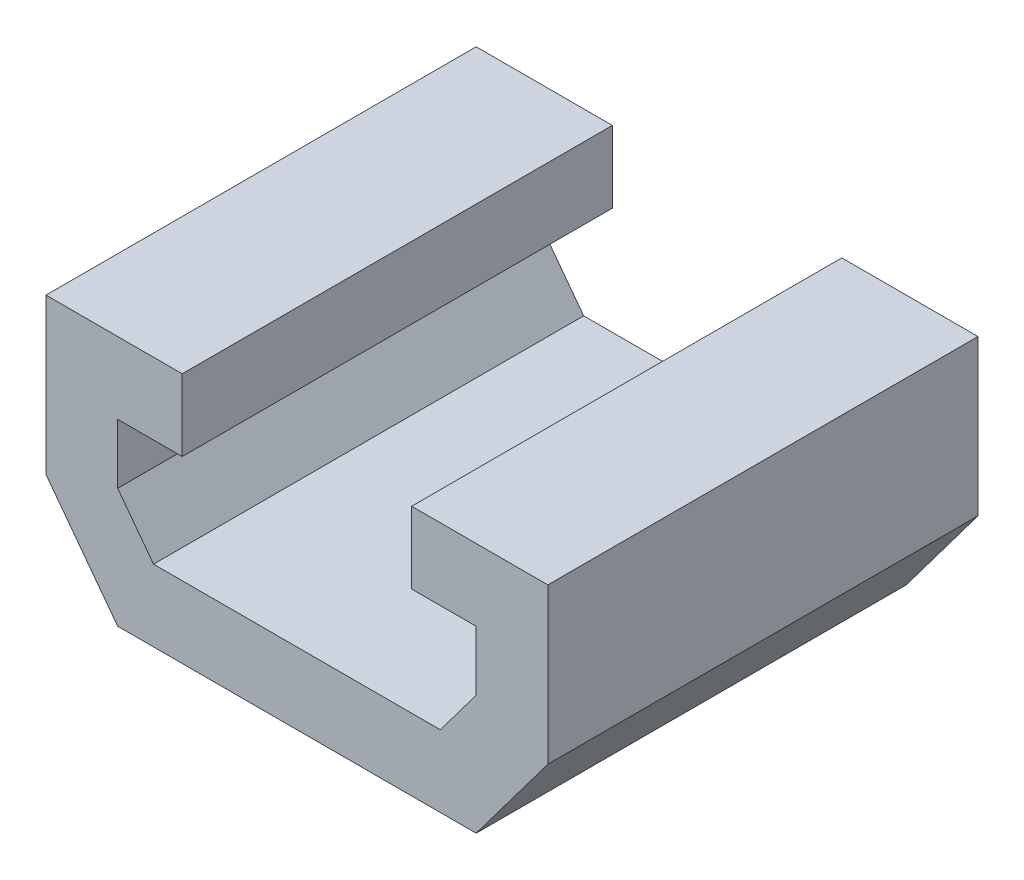
ISO-10303-21;
HEADER;
FILE_DESCRIPTION(('STEP AP214'),'2;1');
FILE_NAME('part.step','',(''),(''),'','','');
FILE_SCHEMA(('AUTOMOTIVE_DESIGN { 1 0 10303 214 1 1 1 1 }'));
ENDSEC;
DATA;
#1=APPLICATION_CONTEXT('core data for automotive mechanical design processes');
#2=APPLICATION_PROTOCOL_DEFINITION('international standard','automotive_design',2000,#1);
#3=PRODUCT_CONTEXT('',#1,'mechanical');
#4=PRODUCT('Part','Part','',(#3));
#5=PRODUCT_RELATED_PRODUCT_CATEGORY('part','',(#4));
#6=PRODUCT_DEFINITION_FORMATION('','',#4);
#7=PRODUCT_DEFINITION_CONTEXT('part definition',#1,'design');
#8=PRODUCT_DEFINITION('design','',#6,#7);
#9=PRODUCT_DEFINITION_SHAPE('','',#8);
#10=(LENGTH_UNIT() NAMED_UNIT(*) SI_UNIT(.MILLI.,.METRE.));
#11=(NAMED_UNIT(*) PLANE_ANGLE_UNIT() SI_UNIT($,.RADIAN.));
#12=(NAMED_UNIT(*) SI_UNIT($,.STERADIAN.) SOLID_ANGLE_UNIT());
#13=UNCERTAINTY_MEASURE_WITH_UNIT(LENGTH_MEASURE(1.E-05),#10,'distance_accuracy_value','');
#14=(GEOMETRIC_REPRESENTATION_CONTEXT(3) GLOBAL_UNCERTAINTY_ASSIGNED_CONTEXT((#13)) GLOBAL_UNIT_ASSIGNED_CONTEXT((#10,
#11,#12)) REPRESENTATION_CONTEXT('',''));
#15=CARTESIAN_POINT('',(0.,0.,0.));
#16=DIRECTION('',(0.,0.,1.));
#17=DIRECTION('',(1.,0.,0.));
#18=AXIS2_PLACEMENT_3D('',#15,#16,#17);
#19=CARTESIAN_POINT('',(-3.175,1.905,7.62));
#20=DIRECTION('',(0.,1.,0.));
#21=DIRECTION('',(-1.,0.,0.));
#22=AXIS2_PLACEMENT_3D('',#19,#20,#21);
#23=PLANE('',#22);
#24=DIRECTION('',(1.,0.,0.));
#25=VECTOR('',#24,1.);
#26=CARTESIAN_POINT('',(-3.175,1.905,0.));
#27=LINE('',#26,#25);
#28=CARTESIAN_POINT('',(-3.175,1.905,0.));
#29=VERTEX_POINT('',#28);
#30=CARTESIAN_POINT('',(-2.032,1.905,0.));
#31=VERTEX_POINT('',#30);
#32=EDGE_CURVE('E147',#29,#31,#27,.T.);
#33=ORIENTED_EDGE('',*,*,#32,.T.);
#34=DIRECTION('',(0.,0.,-1.));
#35=VECTOR('',#34,1.);
#36=CARTESIAN_POINT('',(-2.032,1.905,7.62));
#37=LINE('',#36,#35);
#38=CARTESIAN_POINT('',(-2.032,1.905,7.62));
#39=VERTEX_POINT('',#38);
#40=EDGE_CURVE('E11',#39,#31,#37,.T.);
#41=ORIENTED_EDGE('',*,*,#40,.F.);
#42=DIRECTION('',(1.,0.,0.));
#43=VECTOR('',#42,1.);
#44=CARTESIAN_POINT('',(-3.175,1.905,7.62));
#45=LINE('',#44,#43);
#46=CARTESIAN_POINT('',(-3.175,1.905,7.62));
#47=VERTEX_POINT('',#46);
#48=EDGE_CURVE('E97',#47,#39,#45,.T.);
#49=ORIENTED_EDGE('',*,*,#48,.F.);
#50=DIRECTION('',(0.,0.,-1.));
#51=VECTOR('',#50,1.);
#52=CARTESIAN_POINT('',(-3.175,1.905,7.62));
#53=LINE('',#52,#51);
#54=EDGE_CURVE('E143',#47,#29,#53,.T.);
#55=ORIENTED_EDGE('',*,*,#54,.T.);
#56=EDGE_LOOP('',(#33,#41,#49,#55));
#57=FACE_BOUND('',#56,.T.);
#58=ADVANCED_FACE('F39',(#57),#23,.F.);
#59=CARTESIAN_POINT('',(-2.032,3.175,7.62));
#60=DIRECTION('',(1.,0.,0.));
#61=DIRECTION('',(0.,1.,0.));
#62=AXIS2_PLACEMENT_3D('',#59,#60,#61);
#63=PLANE('',#62);
#64=DIRECTION('',(0.,-1.,0.));
#65=VECTOR('',#64,1.);
#66=CARTESIAN_POINT('',(-2.032,3.175,0.));
#67=LINE('',#66,#65);
#68=CARTESIAN_POINT('',(-2.032,3.175,0.));
#69=VERTEX_POINT('',#68);
#70=EDGE_CURVE('E151',#69,#31,#67,.T.);
#71=ORIENTED_EDGE('',*,*,#70,.F.);
#72=DIRECTION('',(0.,0.,-1.));
#73=VECTOR('',#72,1.);
#74=CARTESIAN_POINT('',(-2.032,3.175,7.62));
#75=LINE('',#74,#73);
#76=CARTESIAN_POINT('',(-2.032,3.175,7.62));
#77=VERTEX_POINT('',#76);
#78=EDGE_CURVE('E48',#77,#69,#75,.T.);
#79=ORIENTED_EDGE('',*,*,#78,.F.);
#80=DIRECTION('',(0.,-1.,0.));
#81=VECTOR('',#80,1.);
#82=CARTESIAN_POINT('',(-2.032,3.175,7.62));
#83=LINE('',#82,#81);
#84=EDGE_CURVE('E212',#77,#39,#83,.T.);
#85=ORIENTED_EDGE('',*,*,#84,.T.);
#86=ORIENTED_EDGE('',*,*,#40,.T.);
#87=EDGE_LOOP('',(#71,#79,#85,#86));
#88=FACE_BOUND('',#87,.T.);
#89=ADVANCED_FACE('F199',(#88),#63,.T.);
#90=CARTESIAN_POINT('',(-3.175,3.175,7.62));
#91=DIRECTION('',(0.,1.,0.));
#92=DIRECTION('',(-1.,0.,0.));
#93=AXIS2_PLACEMENT_3D('',#90,#91,#92);
#94=PLANE('',#93);
#95=DIRECTION('',(1.,0.,0.));
#96=VECTOR('',#95,1.);
#97=CARTESIAN_POINT('',(-3.175,3.175,0.));
#98=LINE('',#97,#96);
#99=CARTESIAN_POINT('',(-4.445,3.175,0.));
#100=VERTEX_POINT('',#99);
#101=EDGE_CURVE('E156',#100,#69,#98,.T.);
#102=ORIENTED_EDGE('',*,*,#101,.F.);
#103=DIRECTION('',(0.,0.,-1.));
#104=VECTOR('',#103,1.);
#105=CARTESIAN_POINT('',(-4.445,3.175,7.62));
#106=LINE('',#105,#104);
#107=CARTESIAN_POINT('',(-4.445,3.175,7.62));
#108=VERTEX_POINT('',#107);
#109=EDGE_CURVE('E187',#108,#100,#106,.T.);
#110=ORIENTED_EDGE('',*,*,#109,.F.);
#111=DIRECTION('',(1.,0.,0.));
#112=VECTOR('',#111,1.);
#113=CARTESIAN_POINT('',(-3.175,3.175,7.62));
#114=LINE('',#113,#112);
#115=EDGE_CURVE('E196',#108,#77,#114,.T.);
#116=ORIENTED_EDGE('',*,*,#115,.T.);
#117=ORIENTED_EDGE('',*,*,#78,.T.);
#118=EDGE_LOOP('',(#102,#110,#116,#117));
#119=FACE_BOUND('',#118,.T.);
#120=ADVANCED_FACE('F194',(#119),#94,.T.);
#121=CARTESIAN_POINT('',(-4.445,0.846666666666666,7.62));
#122=DIRECTION('',(-1.,0.,0.));
#123=DIRECTION('',(0.,0.,1.));
#124=AXIS2_PLACEMENT_3D('',#121,#122,#123);
#125=PLANE('',#124);
#126=DIRECTION('',(0.,1.,0.));
#127=VECTOR('',#126,1.);
#128=CARTESIAN_POINT('',(-4.445,0.846666666666666,0.));
#129=LINE('',#128,#127);
#130=CARTESIAN_POINT('',(-4.445,0.423333333333334,0.));
#131=VERTEX_POINT('',#130);
#132=EDGE_CURVE('E160',#131,#100,#129,.T.);
#133=ORIENTED_EDGE('',*,*,#132,.F.);
#134=DIRECTION('',(0.,0.,-1.));
#135=VECTOR('',#134,1.);
#136=CARTESIAN_POINT('',(-4.445,0.423333333333334,7.62));
#137=LINE('',#136,#135);
#138=CARTESIAN_POINT('',(-4.445,0.423333333333334,7.62));
#139=VERTEX_POINT('',#138);
#140=EDGE_CURVE('E184',#139,#131,#137,.T.);
#141=ORIENTED_EDGE('',*,*,#140,.F.);
#142=DIRECTION('',(0.,1.,0.));
#143=VECTOR('',#142,1.);
#144=CARTESIAN_POINT('',(-4.445,0.846666666666666,7.62));
#145=LINE('',#144,#143);
#146=EDGE_CURVE('E209',#139,#108,#145,.T.);
#147=ORIENTED_EDGE('',*,*,#146,.T.);
#148=ORIENTED_EDGE('',*,*,#109,.T.);
#149=EDGE_LOOP('',(#133,#141,#147,#148));
#150=FACE_BOUND('',#149,.T.);
#151=ADVANCED_FACE('F206',(#150),#125,.T.);
#152=CARTESIAN_POINT('',(-3.556,-0.762,7.62));
#153=DIRECTION('',(-0.8,-0.6,0.));
#154=DIRECTION('',(0.6,-0.8,0.));
#155=AXIS2_PLACEMENT_3D('',#152,#153,#154);
#156=PLANE('',#155);
#157=DIRECTION('',(-0.6,0.8,0.));
#158=VECTOR('',#157,1.);
#159=CARTESIAN_POINT('',(-3.556,-0.762,0.));
#160=LINE('',#159,#158);
#161=CARTESIAN_POINT('',(-3.175,-1.27,0.));
#162=VERTEX_POINT('',#161);
#163=EDGE_CURVE('E164',#162,#131,#160,.T.);
#164=ORIENTED_EDGE('',*,*,#163,.F.);
#165=DIRECTION('',(0.,0.,-1.));
#166=VECTOR('',#165,1.);
#167=CARTESIAN_POINT('',(-3.175,-1.27,7.62));
#168=LINE('',#167,#166);
#169=CARTESIAN_POINT('',(-3.175,-1.27,7.62));
#170=VERTEX_POINT('',#169);
#171=EDGE_CURVE('E136',#170,#162,#168,.T.);
#172=ORIENTED_EDGE('',*,*,#171,.F.);
#173=DIRECTION('',(-0.6,0.8,0.));
#174=VECTOR('',#173,1.);
#175=CARTESIAN_POINT('',(-3.556,-0.762,7.62));
#176=LINE('',#175,#174);
#177=EDGE_CURVE('E217',#170,#139,#176,.T.);
#178=ORIENTED_EDGE('',*,*,#177,.T.);
#179=ORIENTED_EDGE('',*,*,#140,.T.);
#180=EDGE_LOOP('',(#164,#172,#178,#179));
#181=FACE_BOUND('',#180,.T.);
#182=ADVANCED_FACE('F472',(#181),#156,.T.);
#183=CARTESIAN_POINT('',(0.,-1.27,7.62));
#184=DIRECTION('',(0.,-1.,0.));
#185=DIRECTION('',(1.,0.,0.));
#186=AXIS2_PLACEMENT_3D('',#183,#184,#185);
#187=PLANE('',#186);
#188=DIRECTION('',(-1.,0.,0.));
#189=VECTOR('',#188,1.);
#190=CARTESIAN_POINT('',(0.,-1.27,0.));
#191=LINE('',#190,#189);
#192=CARTESIAN_POINT('',(3.175,-1.27,0.));
#193=VERTEX_POINT('',#192);
#194=EDGE_CURVE('E168',#193,#162,#191,.T.);
#195=ORIENTED_EDGE('',*,*,#194,.F.);
#196=DIRECTION('',(0.,0.,-1.));
#197=VECTOR('',#196,1.);
#198=CARTESIAN_POINT('',(3.175,-1.27,7.62));
#199=LINE('',#198,#197);
#200=CARTESIAN_POINT('',(3.175,-1.27,7.62));
#201=VERTEX_POINT('',#200);
#202=EDGE_CURVE('E232',#201,#193,#199,.T.);
#203=ORIENTED_EDGE('',*,*,#202,.F.);
#204=DIRECTION('',(-1.,0.,0.));
#205=VECTOR('',#204,1.);
#206=CARTESIAN_POINT('',(0.,-1.27,7.62));
#207=LINE('',#206,#205);
#208=EDGE_CURVE('E129',#201,#170,#207,.T.);
#209=ORIENTED_EDGE('',*,*,#208,.T.);
#210=ORIENTED_EDGE('',*,*,#171,.T.);
#211=EDGE_LOOP('',(#195,#203,#209,#210));
#212=FACE_BOUND('',#211,.T.);
#213=ADVANCED_FACE('F229',(#212),#187,.T.);
#214=CARTESIAN_POINT('',(0.,0.,7.62));
#215=DIRECTION('',(0.,-1.,0.));
#216=DIRECTION('',(1.,0.,0.));
#217=AXIS2_PLACEMENT_3D('',#214,#215,#216);
#218=PLANE('',#217);
#219=DIRECTION('',(-1.,0.,0.));
#220=VECTOR('',#219,1.);
#221=CARTESIAN_POINT('',(0.,0.,0.));
#222=LINE('',#221,#220);
#223=CARTESIAN_POINT('',(2.54,0.,0.));
#224=VERTEX_POINT('',#223);
#225=CARTESIAN_POINT('',(-2.54,0.,0.));
#226=VERTEX_POINT('',#225);
#227=EDGE_CURVE('E134',#224,#226,#222,.T.);
#228=ORIENTED_EDGE('',*,*,#227,.T.);
#229=DIRECTION('',(0.,0.,-1.));
#230=VECTOR('',#229,1.);
#231=CARTESIAN_POINT('',(-2.54,0.,7.62));
#232=LINE('',#231,#230);
#233=CARTESIAN_POINT('',(-2.54,0.,7.62));
#234=VERTEX_POINT('',#233);
#235=EDGE_CURVE('E131',#234,#226,#232,.T.);
#236=ORIENTED_EDGE('',*,*,#235,.F.);
#237=DIRECTION('',(-1.,0.,0.));
#238=VECTOR('',#237,1.);
#239=CARTESIAN_POINT('',(0.,0.,7.62));
#240=LINE('',#239,#238);
#241=CARTESIAN_POINT('',(2.54,0.,7.62));
#242=VERTEX_POINT('',#241);
#243=EDGE_CURVE('E116',#242,#234,#240,.T.);
#244=ORIENTED_EDGE('',*,*,#243,.F.);
#245=DIRECTION('',(0.,0.,-1.));
#246=VECTOR('',#245,1.);
#247=CARTESIAN_POINT('',(2.54,0.,7.62));
#248=LINE('',#247,#246);
#249=EDGE_CURVE('E346',#242,#224,#248,.T.);
#250=ORIENTED_EDGE('',*,*,#249,.T.);
#251=EDGE_LOOP('',(#228,#236,#244,#250));
#252=FACE_BOUND('',#251,.T.);
#253=ADVANCED_FACE('F132',(#252),#218,.F.);
#254=CARTESIAN_POINT('',(-2.54,0.,7.62));
#255=DIRECTION('',(-0.8,-0.6,0.));
#256=DIRECTION('',(0.6,-0.8,0.));
#257=AXIS2_PLACEMENT_3D('',#254,#255,#256);
#258=PLANE('',#257);
#259=DIRECTION('',(-0.6,0.8,0.));
#260=VECTOR('',#259,1.);
#261=CARTESIAN_POINT('',(-2.54,0.,0.));
#262=LINE('',#261,#260);
#263=CARTESIAN_POINT('',(-3.175,0.846666666666666,0.));
#264=VERTEX_POINT('',#263);
#265=EDGE_CURVE('E85',#226,#264,#262,.T.);
#266=ORIENTED_EDGE('',*,*,#265,.T.);
#267=DIRECTION('',(0.,0.,-1.));
#268=VECTOR('',#267,1.);
#269=CARTESIAN_POINT('',(-3.175,0.846666666666666,7.62));
#270=LINE('',#269,#268);
#271=CARTESIAN_POINT('',(-3.175,0.846666666666666,7.62));
#272=VERTEX_POINT('',#271);
#273=EDGE_CURVE('E137',#272,#264,#270,.T.);
#274=ORIENTED_EDGE('',*,*,#273,.F.);
#275=DIRECTION('',(-0.6,0.8,0.));
#276=VECTOR('',#275,1.);
#277=CARTESIAN_POINT('',(-2.54,0.,7.62));
#278=LINE('',#277,#276);
#279=EDGE_CURVE('E120',#234,#272,#278,.T.);
#280=ORIENTED_EDGE('',*,*,#279,.F.);
#281=ORIENTED_EDGE('',*,*,#235,.T.);
#282=EDGE_LOOP('',(#266,#274,#280,#281));
#283=FACE_BOUND('',#282,.T.);
#284=ADVANCED_FACE('F139',(#283),#258,.F.);
#285=CARTESIAN_POINT('',(-3.175,0.846666666666666,7.62));
#286=DIRECTION('',(-1.,0.,0.));
#287=DIRECTION('',(0.,0.,1.));
#288=AXIS2_PLACEMENT_3D('',#285,#286,#287);
#289=PLANE('',#288);
#290=DIRECTION('',(0.,1.,0.));
#291=VECTOR('',#290,1.);
#292=CARTESIAN_POINT('',(-3.175,0.846666666666666,0.));
#293=LINE('',#292,#291);
#294=EDGE_CURVE('E91',#264,#29,#293,.T.);
#295=ORIENTED_EDGE('',*,*,#294,.T.);
#296=ORIENTED_EDGE('',*,*,#54,.F.);
#297=DIRECTION('',(0.,1.,0.));
#298=VECTOR('',#297,1.);
#299=CARTESIAN_POINT('',(-3.175,0.846666666666666,7.62));
#300=LINE('',#299,#298);
#301=EDGE_CURVE('E56',#272,#47,#300,.T.);
#302=ORIENTED_EDGE('',*,*,#301,.F.);
#303=ORIENTED_EDGE('',*,*,#273,.T.);
#304=EDGE_LOOP('',(#295,#296,#302,#303));
#305=FACE_BOUND('',#304,.T.);
#306=ADVANCED_FACE('F452',(#305),#289,.F.);
#307=CARTESIAN_POINT('',(0.,0.,7.62));
#308=DIRECTION('',(0.,0.,-1.));
#309=DIRECTION('',(-1.,0.,0.));
#310=AXIS2_PLACEMENT_3D('',#307,#308,#309);
#311=PLANE('',#310);
#312=ORIENTED_EDGE('',*,*,#48,.T.);
#313=ORIENTED_EDGE('',*,*,#84,.F.);
#314=ORIENTED_EDGE('',*,*,#115,.F.);
#315=ORIENTED_EDGE('',*,*,#146,.F.);
#316=ORIENTED_EDGE('',*,*,#177,.F.);
#317=ORIENTED_EDGE('',*,*,#208,.F.);
#318=DIRECTION('',(0.6,0.8,0.));
#319=VECTOR('',#318,1.);
#320=CARTESIAN_POINT('',(3.556,-0.761999999999999,7.62));
#321=LINE('',#320,#319);
#322=CARTESIAN_POINT('',(4.445,0.423333333333335,7.62));
#323=VERTEX_POINT('',#322);
#324=EDGE_CURVE('E237',#201,#323,#321,.T.);
#325=ORIENTED_EDGE('',*,*,#324,.T.);
#326=DIRECTION('',(0.,1.,0.));
#327=VECTOR('',#326,1.);
#328=CARTESIAN_POINT('',(4.445,0.846666666666667,7.62));
#329=LINE('',#328,#327);
#330=CARTESIAN_POINT('',(4.445,3.175,7.62));
#331=VERTEX_POINT('',#330);
#332=EDGE_CURVE('E285',#323,#331,#329,.T.);
#333=ORIENTED_EDGE('',*,*,#332,.T.);
#334=DIRECTION('',(-1.,0.,0.));
#335=VECTOR('',#334,1.);
#336=CARTESIAN_POINT('',(3.175,3.175,7.62));
#337=LINE('',#336,#335);
#338=CARTESIAN_POINT('',(2.032,3.175,7.62));
#339=VERTEX_POINT('',#338);
#340=EDGE_CURVE('E288',#331,#339,#337,.T.);
#341=ORIENTED_EDGE('',*,*,#340,.T.);
#342=DIRECTION('',(0.,-1.,0.));
#343=VECTOR('',#342,1.);
#344=CARTESIAN_POINT('',(2.032,3.175,7.62));
#345=LINE('',#344,#343);
#346=CARTESIAN_POINT('',(2.032,1.905,7.62));
#347=VERTEX_POINT('',#346);
#348=EDGE_CURVE('E281',#339,#347,#345,.T.);
#349=ORIENTED_EDGE('',*,*,#348,.T.);
#350=DIRECTION('',(-1.,0.,0.));
#351=VECTOR('',#350,1.);
#352=CARTESIAN_POINT('',(3.175,1.905,7.62));
#353=LINE('',#352,#351);
#354=CARTESIAN_POINT('',(3.175,1.905,7.62));
#355=VERTEX_POINT('',#354);
#356=EDGE_CURVE('E310',#355,#347,#353,.T.);
#357=ORIENTED_EDGE('',*,*,#356,.F.);
#358=DIRECTION('',(0.,1.,0.));
#359=VECTOR('',#358,1.);
#360=CARTESIAN_POINT('',(3.175,0.846666666666667,7.62));
#361=LINE('',#360,#359);
#362=CARTESIAN_POINT('',(3.175,0.846666666666667,7.62));
#363=VERTEX_POINT('',#362);
#364=EDGE_CURVE('E318',#363,#355,#361,.T.);
#365=ORIENTED_EDGE('',*,*,#364,.F.);
#366=DIRECTION('',(0.6,0.8,0.));
#367=VECTOR('',#366,1.);
#368=CARTESIAN_POINT('',(2.54,0.,7.62));
#369=LINE('',#368,#367);
#370=EDGE_CURVE('E124',#242,#363,#369,.T.);
#371=ORIENTED_EDGE('',*,*,#370,.F.);
#372=ORIENTED_EDGE('',*,*,#243,.T.);
#373=ORIENTED_EDGE('',*,*,#279,.T.);
#374=ORIENTED_EDGE('',*,*,#301,.T.);
#375=EDGE_LOOP('',(#312,#313,#314,#315,#316,#317,#325,#333,#341,#349,#357,#365,#371,#372,#373,#374));
#376=FACE_BOUND('',#375,.T.);
#377=ADVANCED_FACE('F118',(#376),#311,.F.);
#378=CARTESIAN_POINT('',(0.,0.,0.));
#379=DIRECTION('',(0.,0.,-1.));
#380=DIRECTION('',(-1.,0.,0.));
#381=AXIS2_PLACEMENT_3D('',#378,#379,#380);
#382=PLANE('',#381);
#383=ORIENTED_EDGE('',*,*,#32,.F.);
#384=ORIENTED_EDGE('',*,*,#294,.F.);
#385=ORIENTED_EDGE('',*,*,#265,.F.);
#386=ORIENTED_EDGE('',*,*,#227,.F.);
#387=DIRECTION('',(0.6,0.8,0.));
#388=VECTOR('',#387,1.);
#389=CARTESIAN_POINT('',(2.54,0.,0.));
#390=LINE('',#389,#388);
#391=CARTESIAN_POINT('',(3.175,0.846666666666667,0.));
#392=VERTEX_POINT('',#391);
#393=EDGE_CURVE('E336',#224,#392,#390,.T.);
#394=ORIENTED_EDGE('',*,*,#393,.T.);
#395=DIRECTION('',(0.,1.,0.));
#396=VECTOR('',#395,1.);
#397=CARTESIAN_POINT('',(3.175,0.846666666666667,0.));
#398=LINE('',#397,#396);
#399=CARTESIAN_POINT('',(3.175,1.905,0.));
#400=VERTEX_POINT('',#399);
#401=EDGE_CURVE('E270',#392,#400,#398,.T.);
#402=ORIENTED_EDGE('',*,*,#401,.T.);
#403=DIRECTION('',(-1.,0.,0.));
#404=VECTOR('',#403,1.);
#405=CARTESIAN_POINT('',(3.175,1.905,0.));
#406=LINE('',#405,#404);
#407=CARTESIAN_POINT('',(2.032,1.905,0.));
#408=VERTEX_POINT('',#407);
#409=EDGE_CURVE('E322',#400,#408,#406,.T.);
#410=ORIENTED_EDGE('',*,*,#409,.T.);
#411=DIRECTION('',(0.,-1.,0.));
#412=VECTOR('',#411,1.);
#413=CARTESIAN_POINT('',(2.032,3.175,0.));
#414=LINE('',#413,#412);
#415=CARTESIAN_POINT('',(2.032,3.175,0.));
#416=VERTEX_POINT('',#415);
#417=EDGE_CURVE('E325',#416,#408,#414,.T.);
#418=ORIENTED_EDGE('',*,*,#417,.F.);
#419=DIRECTION('',(-1.,0.,0.));
#420=VECTOR('',#419,1.);
#421=CARTESIAN_POINT('',(3.175,3.175,0.));
#422=LINE('',#421,#420);
#423=CARTESIAN_POINT('',(4.445,3.175,0.));
#424=VERTEX_POINT('',#423);
#425=EDGE_CURVE('E328',#424,#416,#422,.T.);
#426=ORIENTED_EDGE('',*,*,#425,.F.);
#427=DIRECTION('',(0.,1.,0.));
#428=VECTOR('',#427,1.);
#429=CARTESIAN_POINT('',(4.445,0.846666666666667,0.));
#430=LINE('',#429,#428);
#431=CARTESIAN_POINT('',(4.445,0.423333333333335,0.));
#432=VERTEX_POINT('',#431);
#433=EDGE_CURVE('E298',#432,#424,#430,.T.);
#434=ORIENTED_EDGE('',*,*,#433,.F.);
#435=DIRECTION('',(0.6,0.8,0.));
#436=VECTOR('',#435,1.);
#437=CARTESIAN_POINT('',(3.556,-0.761999999999999,0.));
#438=LINE('',#437,#436);
#439=EDGE_CURVE('E333',#193,#432,#438,.T.);
#440=ORIENTED_EDGE('',*,*,#439,.F.);
#441=ORIENTED_EDGE('',*,*,#194,.T.);
#442=ORIENTED_EDGE('',*,*,#163,.T.);
#443=ORIENTED_EDGE('',*,*,#132,.T.);
#444=ORIENTED_EDGE('',*,*,#101,.T.);
#445=ORIENTED_EDGE('',*,*,#70,.T.);
#446=EDGE_LOOP('',(#383,#384,#385,#386,#394,#402,#410,#418,#426,#434,#440,#441,#442,#443,#444,#445));
#447=FACE_BOUND('',#446,.T.);
#448=ADVANCED_FACE('F202',(#447),#382,.T.);
#449=CARTESIAN_POINT('',(3.175,1.905,7.62));
#450=DIRECTION('',(0.,1.,0.));
#451=DIRECTION('',(1.,0.,0.));
#452=AXIS2_PLACEMENT_3D('',#449,#450,#451);
#453=PLANE('',#452);
#454=ORIENTED_EDGE('',*,*,#409,.F.);
#455=DIRECTION('',(0.,0.,-1.));
#456=VECTOR('',#455,1.);
#457=CARTESIAN_POINT('',(3.175,1.905,7.62));
#458=LINE('',#457,#456);
#459=EDGE_CURVE('E321',#355,#400,#458,.T.);
#460=ORIENTED_EDGE('',*,*,#459,.F.);
#461=ORIENTED_EDGE('',*,*,#356,.T.);
#462=DIRECTION('',(0.,0.,-1.));
#463=VECTOR('',#462,1.);
#464=CARTESIAN_POINT('',(2.032,1.905,7.62));
#465=LINE('',#464,#463);
#466=EDGE_CURVE('E152',#347,#408,#465,.T.);
#467=ORIENTED_EDGE('',*,*,#466,.T.);
#468=EDGE_LOOP('',(#454,#460,#461,#467));
#469=FACE_BOUND('',#468,.T.);
#470=ADVANCED_FACE('F361',(#469),#453,.F.);
#471=CARTESIAN_POINT('',(2.032,3.175,7.62));
#472=DIRECTION('',(-1.,0.,0.));
#473=DIRECTION('',(0.,1.,0.));
#474=AXIS2_PLACEMENT_3D('',#471,#472,#473);
#475=PLANE('',#474);
#476=ORIENTED_EDGE('',*,*,#417,.T.);
#477=ORIENTED_EDGE('',*,*,#466,.F.);
#478=ORIENTED_EDGE('',*,*,#348,.F.);
#479=DIRECTION('',(0.,0.,-1.));
#480=VECTOR('',#479,1.);
#481=CARTESIAN_POINT('',(2.032,3.175,7.62));
#482=LINE('',#481,#480);
#483=EDGE_CURVE('E302',#339,#416,#482,.T.);
#484=ORIENTED_EDGE('',*,*,#483,.T.);
#485=EDGE_LOOP('',(#476,#477,#478,#484));
#486=FACE_BOUND('',#485,.T.);
#487=ADVANCED_FACE('F365',(#486),#475,.T.);
#488=CARTESIAN_POINT('',(3.175,3.175,7.62));
#489=DIRECTION('',(0.,1.,0.));
#490=DIRECTION('',(1.,0.,0.));
#491=AXIS2_PLACEMENT_3D('',#488,#489,#490);
#492=PLANE('',#491);
#493=ORIENTED_EDGE('',*,*,#425,.T.);
#494=ORIENTED_EDGE('',*,*,#483,.F.);
#495=ORIENTED_EDGE('',*,*,#340,.F.);
#496=DIRECTION('',(0.,0.,-1.));
#497=VECTOR('',#496,1.);
#498=CARTESIAN_POINT('',(4.445,3.175,7.62));
#499=LINE('',#498,#497);
#500=EDGE_CURVE('E295',#331,#424,#499,.T.);
#501=ORIENTED_EDGE('',*,*,#500,.T.);
#502=EDGE_LOOP('',(#493,#494,#495,#501));
#503=FACE_BOUND('',#502,.T.);
#504=ADVANCED_FACE('F305',(#503),#492,.T.);
#505=CARTESIAN_POINT('',(4.445,0.846666666666667,7.62));
#506=DIRECTION('',(1.,0.,0.));
#507=DIRECTION('',(0.,0.,1.));
#508=AXIS2_PLACEMENT_3D('',#505,#506,#507);
#509=PLANE('',#508);
#510=ORIENTED_EDGE('',*,*,#433,.T.);
#511=ORIENTED_EDGE('',*,*,#500,.F.);
#512=ORIENTED_EDGE('',*,*,#332,.F.);
#513=DIRECTION('',(0.,0.,-1.));
#514=VECTOR('',#513,1.);
#515=CARTESIAN_POINT('',(4.445,0.423333333333335,7.62));
#516=LINE('',#515,#514);
#517=EDGE_CURVE('E303',#323,#432,#516,.T.);
#518=ORIENTED_EDGE('',*,*,#517,.T.);
#519=EDGE_LOOP('',(#510,#511,#512,#518));
#520=FACE_BOUND('',#519,.T.);
#521=ADVANCED_FACE('F296',(#520),#509,.T.);
#522=CARTESIAN_POINT('',(3.556,-0.761999999999999,7.62));
#523=DIRECTION('',(0.8,-0.6,0.));
#524=DIRECTION('',(-0.6,-0.8,0.));
#525=AXIS2_PLACEMENT_3D('',#522,#523,#524);
#526=PLANE('',#525);
#527=ORIENTED_EDGE('',*,*,#439,.T.);
#528=ORIENTED_EDGE('',*,*,#517,.F.);
#529=ORIENTED_EDGE('',*,*,#324,.F.);
#530=ORIENTED_EDGE('',*,*,#202,.T.);
#531=EDGE_LOOP('',(#527,#528,#529,#530));
#532=FACE_BOUND('',#531,.T.);
#533=ADVANCED_FACE('F389',(#532),#526,.T.);
#534=CARTESIAN_POINT('',(2.54,0.,7.62));
#535=DIRECTION('',(0.8,-0.6,0.));
#536=DIRECTION('',(-0.6,-0.8,0.));
#537=AXIS2_PLACEMENT_3D('',#534,#535,#536);
#538=PLANE('',#537);
#539=ORIENTED_EDGE('',*,*,#393,.F.);
#540=ORIENTED_EDGE('',*,*,#249,.F.);
#541=ORIENTED_EDGE('',*,*,#370,.T.);
#542=DIRECTION('',(0.,0.,-1.));
#543=VECTOR('',#542,1.);
#544=CARTESIAN_POINT('',(3.175,0.846666666666667,7.62));
#545=LINE('',#544,#543);
#546=EDGE_CURVE('E343',#363,#392,#545,.T.);
#547=ORIENTED_EDGE('',*,*,#546,.T.);
#548=EDGE_LOOP('',(#539,#540,#541,#547));
#549=FACE_BOUND('',#548,.T.);
#550=ADVANCED_FACE('F381',(#549),#538,.F.);
#551=CARTESIAN_POINT('',(3.175,0.846666666666667,7.62));
#552=DIRECTION('',(1.,0.,0.));
#553=DIRECTION('',(0.,0.,1.));
#554=AXIS2_PLACEMENT_3D('',#551,#552,#553);
#555=PLANE('',#554);
#556=ORIENTED_EDGE('',*,*,#401,.F.);
#557=ORIENTED_EDGE('',*,*,#546,.F.);
#558=ORIENTED_EDGE('',*,*,#364,.T.);
#559=ORIENTED_EDGE('',*,*,#459,.T.);
#560=EDGE_LOOP('',(#556,#557,#558,#559));
#561=FACE_BOUND('',#560,.T.);
#562=ADVANCED_FACE('F382',(#561),#555,.F.);
#563=CLOSED_SHELL('',(#58,#89,#120,#151,#182,#213,#253,#284,#306,#377,#448,#470,#487,#504,#521,
#533,#550,#562));
#564=MANIFOLD_SOLID_BREP('B2',#563);
#565=ADVANCED_BREP_SHAPE_REPRESENTATION('',(#18,#564),#14);
#566=SHAPE_DEFINITION_REPRESENTATION(#9,#565);
ENDSEC;
END-ISO-10303-21;
